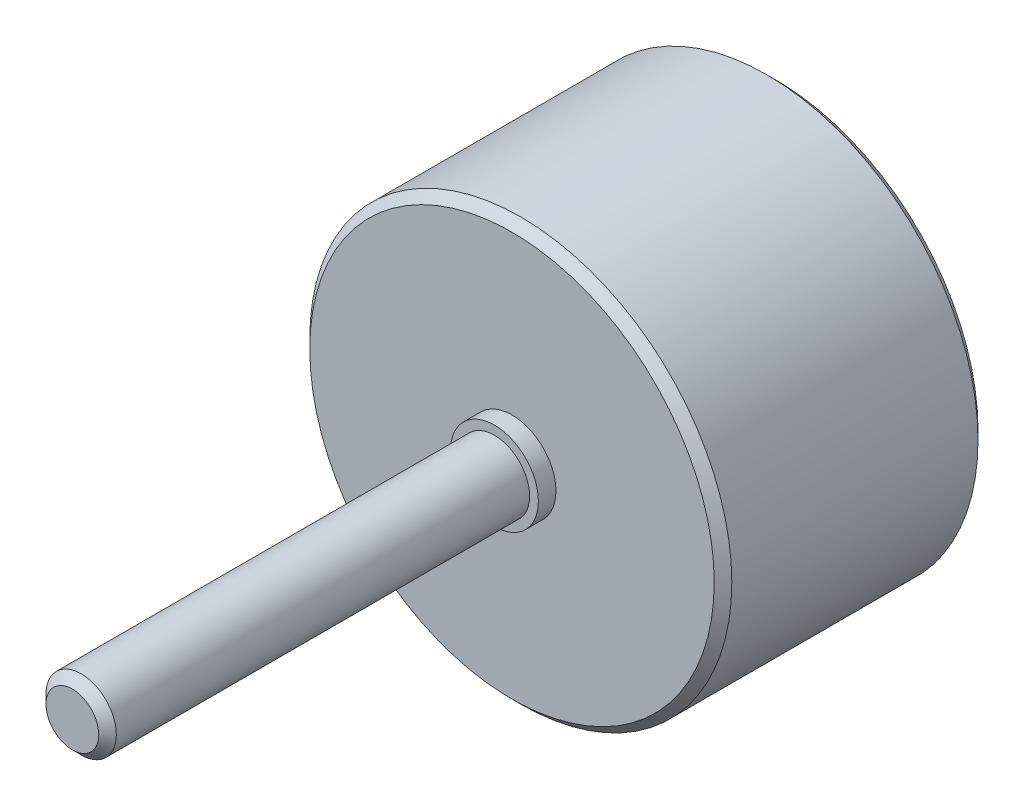
ISO-10303-21;
HEADER;
FILE_DESCRIPTION(('STEP AP214'),'2;1');
FILE_NAME('part.step','',(''),(''),'','','');
FILE_SCHEMA(('AUTOMOTIVE_DESIGN { 1 0 10303 214 1 1 1 1 }'));
ENDSEC;
DATA;
#1=APPLICATION_CONTEXT('core data for automotive mechanical design processes');
#2=APPLICATION_PROTOCOL_DEFINITION('international standard','automotive_design',2000,#1);
#3=PRODUCT_CONTEXT('',#1,'mechanical');
#4=PRODUCT('Part','Part','',(#3));
#5=PRODUCT_RELATED_PRODUCT_CATEGORY('part','',(#4));
#6=PRODUCT_DEFINITION_FORMATION('','',#4);
#7=PRODUCT_DEFINITION_CONTEXT('part definition',#1,'design');
#8=PRODUCT_DEFINITION('design','',#6,#7);
#9=PRODUCT_DEFINITION_SHAPE('','',#8);
#10=(LENGTH_UNIT() NAMED_UNIT(*) SI_UNIT(.MILLI.,.METRE.));
#11=(NAMED_UNIT(*) PLANE_ANGLE_UNIT() SI_UNIT($,.RADIAN.));
#12=(NAMED_UNIT(*) SI_UNIT($,.STERADIAN.) SOLID_ANGLE_UNIT());
#13=UNCERTAINTY_MEASURE_WITH_UNIT(LENGTH_MEASURE(1.E-05),#10,'distance_accuracy_value','');
#14=(GEOMETRIC_REPRESENTATION_CONTEXT(3) GLOBAL_UNCERTAINTY_ASSIGNED_CONTEXT((#13)) GLOBAL_UNIT_ASSIGNED_CONTEXT((#10,
#11,#12)) REPRESENTATION_CONTEXT('',''));
#15=CARTESIAN_POINT('',(0.,0.,0.));
#16=DIRECTION('',(0.,0.,1.));
#17=DIRECTION('',(1.,0.,0.));
#18=AXIS2_PLACEMENT_3D('',#15,#16,#17);
#19=CARTESIAN_POINT('',(0.,0.,30.));
#20=DIRECTION('',(0.,0.,-1.));
#21=DIRECTION('',(-1.,0.,0.));
#22=AXIS2_PLACEMENT_3D('',#19,#20,#21);
#23=CYLINDRICAL_SURFACE('',#22,24.);
#24=CARTESIAN_POINT('',(0.,0.,0.999999999999987));
#25=DIRECTION('',(0.,0.,1.));
#26=DIRECTION('',(1.,0.,0.));
#27=AXIS2_PLACEMENT_3D('',#24,#25,#26);
#28=CIRCLE('',#27,24.);
#29=CARTESIAN_POINT('',(24.,0.,0.999999999999987));
#30=VERTEX_POINT('',#29);
#31=EDGE_CURVE('E53',#30,#30,#28,.T.);
#32=ORIENTED_EDGE('',*,*,#31,.T.);
#33=EDGE_LOOP('',(#32));
#34=FACE_BOUND('',#33,.T.);
#35=CARTESIAN_POINT('',(0.,0.,29.));
#36=DIRECTION('',(0.,0.,1.));
#37=DIRECTION('',(1.,0.,0.));
#38=AXIS2_PLACEMENT_3D('',#35,#36,#37);
#39=CIRCLE('',#38,24.);
#40=CARTESIAN_POINT('',(24.,0.,29.));
#41=VERTEX_POINT('',#40);
#42=EDGE_CURVE('E56',#41,#41,#39,.F.);
#43=ORIENTED_EDGE('',*,*,#42,.T.);
#44=EDGE_LOOP('',(#43));
#45=FACE_BOUND('',#44,.T.);
#46=ADVANCED_FACE('F33',(#34,#45),#23,.T.);
#47=CARTESIAN_POINT('',(0.,0.,30.));
#48=DIRECTION('',(0.,0.,1.));
#49=DIRECTION('',(1.,0.,0.));
#50=AXIS2_PLACEMENT_3D('',#47,#48,#49);
#51=PLANE('',#50);
#52=CARTESIAN_POINT('',(0.,0.,30.));
#53=DIRECTION('',(0.,0.,1.));
#54=DIRECTION('',(1.,0.,0.));
#55=AXIS2_PLACEMENT_3D('',#52,#53,#54);
#56=CIRCLE('',#55,23.);
#57=CARTESIAN_POINT('',(23.,0.,30.));
#58=VERTEX_POINT('',#57);
#59=EDGE_CURVE('E44',#58,#58,#56,.T.);
#60=ORIENTED_EDGE('',*,*,#59,.T.);
#61=EDGE_LOOP('',(#60));
#62=FACE_BOUND('',#61,.T.);
#63=CARTESIAN_POINT('',(0.,0.,30.));
#64=DIRECTION('',(0.,0.,1.));
#65=DIRECTION('',(1.,0.,0.));
#66=AXIS2_PLACEMENT_3D('',#63,#64,#65);
#67=CIRCLE('',#66,5.);
#68=CARTESIAN_POINT('',(5.,0.,30.));
#69=VERTEX_POINT('',#68);
#70=EDGE_CURVE('E63',#69,#69,#67,.T.);
#71=ORIENTED_EDGE('',*,*,#70,.F.);
#72=EDGE_LOOP('',(#71));
#73=FACE_BOUND('',#72,.T.);
#74=ADVANCED_FACE('F87',(#62,#73),#51,.T.);
#75=CARTESIAN_POINT('',(0.,0.,0.));
#76=DIRECTION('',(0.,0.,1.));
#77=DIRECTION('',(1.,0.,0.));
#78=AXIS2_PLACEMENT_3D('',#75,#76,#77);
#79=PLANE('',#78);
#80=CARTESIAN_POINT('',(0.,0.,0.));
#81=DIRECTION('',(0.,0.,1.));
#82=DIRECTION('',(1.,0.,0.));
#83=AXIS2_PLACEMENT_3D('',#80,#81,#82);
#84=CIRCLE('',#83,23.);
#85=CARTESIAN_POINT('',(23.,0.,0.));
#86=VERTEX_POINT('',#85);
#87=EDGE_CURVE('E48',#86,#86,#84,.F.);
#88=ORIENTED_EDGE('',*,*,#87,.T.);
#89=EDGE_LOOP('',(#88));
#90=FACE_BOUND('',#89,.T.);
#91=CARTESIAN_POINT('',(0.,0.,0.));
#92=DIRECTION('',(0.,0.,-1.));
#93=DIRECTION('',(-1.,0.,0.));
#94=AXIS2_PLACEMENT_3D('',#91,#92,#93);
#95=CIRCLE('',#94,3.);
#96=CARTESIAN_POINT('',(-3.,0.,0.));
#97=VERTEX_POINT('',#96);
#98=EDGE_CURVE('E69',#97,#97,#95,.T.);
#99=ORIENTED_EDGE('',*,*,#98,.F.);
#100=EDGE_LOOP('',(#99));
#101=FACE_BOUND('',#100,.T.);
#102=ADVANCED_FACE('F84',(#90,#101),#79,.F.);
#103=CARTESIAN_POINT('',(0.,0.,32.));
#104=DIRECTION('',(0.,0.,-1.));
#105=DIRECTION('',(-1.,0.,0.));
#106=AXIS2_PLACEMENT_3D('',#103,#104,#105);
#107=CYLINDRICAL_SURFACE('',#106,5.);
#108=CARTESIAN_POINT('',(0.,0.,32.));
#109=DIRECTION('',(0.,0.,1.));
#110=DIRECTION('',(1.,0.,0.));
#111=AXIS2_PLACEMENT_3D('',#108,#109,#110);
#112=CIRCLE('',#111,5.);
#113=CARTESIAN_POINT('',(5.,0.,32.));
#114=VERTEX_POINT('',#113);
#115=EDGE_CURVE('E62',#114,#114,#112,.T.);
#116=ORIENTED_EDGE('',*,*,#115,.F.);
#117=EDGE_LOOP('',(#116));
#118=FACE_BOUND('',#117,.T.);
#119=ORIENTED_EDGE('',*,*,#70,.T.);
#120=EDGE_LOOP('',(#119));
#121=FACE_BOUND('',#120,.T.);
#122=ADVANCED_FACE('F86',(#118,#121),#107,.T.);
#123=CARTESIAN_POINT('',(0.,0.,32.));
#124=DIRECTION('',(0.,0.,1.));
#125=DIRECTION('',(1.,0.,0.));
#126=AXIS2_PLACEMENT_3D('',#123,#124,#125);
#127=PLANE('',#126);
#128=CARTESIAN_POINT('',(0.,0.,32.));
#129=DIRECTION('',(0.,0.,1.));
#130=DIRECTION('',(1.,0.,0.));
#131=AXIS2_PLACEMENT_3D('',#128,#129,#130);
#132=CIRCLE('',#131,4.);
#133=CARTESIAN_POINT('',(4.,0.,32.));
#134=VERTEX_POINT('',#133);
#135=EDGE_CURVE('E59',#134,#134,#132,.T.);
#136=ORIENTED_EDGE('',*,*,#135,.F.);
#137=EDGE_LOOP('',(#136));
#138=FACE_BOUND('',#137,.T.);
#139=ORIENTED_EDGE('',*,*,#115,.T.);
#140=EDGE_LOOP('',(#139));
#141=FACE_BOUND('',#140,.T.);
#142=ADVANCED_FACE('F94',(#138,#141),#127,.T.);
#143=CARTESIAN_POINT('',(0.,0.,80.));
#144=DIRECTION('',(0.,0.,1.));
#145=DIRECTION('',(1.,0.,0.));
#146=AXIS2_PLACEMENT_3D('',#143,#144,#145);
#147=PLANE('',#146);
#148=CARTESIAN_POINT('',(0.,0.,80.));
#149=DIRECTION('',(0.,0.,1.));
#150=DIRECTION('',(1.,0.,0.));
#151=AXIS2_PLACEMENT_3D('',#148,#149,#150);
#152=CIRCLE('',#151,3.00000000000002);
#153=CARTESIAN_POINT('',(3.00000000000002,0.,80.));
#154=VERTEX_POINT('',#153);
#155=EDGE_CURVE('E40',#154,#154,#152,.T.);
#156=ORIENTED_EDGE('',*,*,#155,.T.);
#157=EDGE_LOOP('',(#156));
#158=FACE_BOUND('',#157,.T.);
#159=ADVANCED_FACE('F146',(#158),#147,.T.);
#160=CARTESIAN_POINT('',(0.,0.,80.));
#161=DIRECTION('',(0.,0.,-1.));
#162=DIRECTION('',(-1.,0.,0.));
#163=AXIS2_PLACEMENT_3D('',#160,#161,#162);
#164=CYLINDRICAL_SURFACE('',#163,4.);
#165=CARTESIAN_POINT('',(0.,0.,79.));
#166=DIRECTION('',(0.,0.,1.));
#167=DIRECTION('',(1.,0.,0.));
#168=AXIS2_PLACEMENT_3D('',#165,#166,#167);
#169=CIRCLE('',#168,4.);
#170=CARTESIAN_POINT('',(4.,0.,79.));
#171=VERTEX_POINT('',#170);
#172=EDGE_CURVE('E10',#171,#171,#169,.F.);
#173=ORIENTED_EDGE('',*,*,#172,.T.);
#174=EDGE_LOOP('',(#173));
#175=FACE_BOUND('',#174,.T.);
#176=ORIENTED_EDGE('',*,*,#135,.T.);
#177=EDGE_LOOP('',(#176));
#178=FACE_BOUND('',#177,.T.);
#179=ADVANCED_FACE('F80',(#175,#178),#164,.T.);
#180=CARTESIAN_POINT('',(0.,0.,10.));
#181=DIRECTION('',(0.,0.,-1.));
#182=DIRECTION('',(-1.,0.,0.));
#183=AXIS2_PLACEMENT_3D('',#180,#181,#182);
#184=CYLINDRICAL_SURFACE('',#183,3.);
#185=CARTESIAN_POINT('',(0.,0.,10.));
#186=DIRECTION('',(0.,0.,-1.));
#187=DIRECTION('',(-1.,0.,0.));
#188=AXIS2_PLACEMENT_3D('',#185,#186,#187);
#189=CIRCLE('',#188,3.);
#190=CARTESIAN_POINT('',(-3.,0.,10.));
#191=VERTEX_POINT('',#190);
#192=EDGE_CURVE('E66',#191,#191,#189,.T.);
#193=ORIENTED_EDGE('',*,*,#192,.F.);
#194=EDGE_LOOP('',(#193));
#195=FACE_BOUND('',#194,.T.);
#196=ORIENTED_EDGE('',*,*,#98,.T.);
#197=EDGE_LOOP('',(#196));
#198=FACE_BOUND('',#197,.T.);
#199=ADVANCED_FACE('F77',(#195,#198),#184,.F.);
#200=CARTESIAN_POINT('',(0.,0.,10.));
#201=DIRECTION('',(0.,0.,-1.));
#202=DIRECTION('',(-1.,0.,0.));
#203=AXIS2_PLACEMENT_3D('',#200,#201,#202);
#204=PLANE('',#203);
#205=ORIENTED_EDGE('',*,*,#192,.T.);
#206=EDGE_LOOP('',(#205));
#207=FACE_BOUND('',#206,.T.);
#208=ADVANCED_FACE('F75',(#207),#204,.T.);
#209=CARTESIAN_POINT('',(0.,0.,0.999999999999987));
#210=DIRECTION('',(0.,0.,1.));
#211=DIRECTION('',(1.,0.,0.));
#212=AXIS2_PLACEMENT_3D('',#209,#210,#211);
#213=CONICAL_SURFACE('',#212,24.,0.785398163397452);
#214=ORIENTED_EDGE('',*,*,#87,.F.);
#215=EDGE_LOOP('',(#214));
#216=FACE_BOUND('',#215,.T.);
#217=ORIENTED_EDGE('',*,*,#31,.F.);
#218=EDGE_LOOP('',(#217));
#219=FACE_BOUND('',#218,.T.);
#220=ADVANCED_FACE('F106',(#216,#219),#213,.T.);
#221=CARTESIAN_POINT('',(0.,0.,30.));
#222=DIRECTION('',(0.,0.,-1.));
#223=DIRECTION('',(-1.,0.,0.));
#224=AXIS2_PLACEMENT_3D('',#221,#222,#223);
#225=CONICAL_SURFACE('',#224,23.,0.78539816339744);
#226=ORIENTED_EDGE('',*,*,#42,.F.);
#227=EDGE_LOOP('',(#226));
#228=FACE_BOUND('',#227,.T.);
#229=ORIENTED_EDGE('',*,*,#59,.F.);
#230=EDGE_LOOP('',(#229));
#231=FACE_BOUND('',#230,.T.);
#232=ADVANCED_FACE('F108',(#228,#231),#225,.T.);
#233=CARTESIAN_POINT('',(0.,0.,80.));
#234=DIRECTION('',(0.,0.,-1.));
#235=DIRECTION('',(-1.,0.,0.));
#236=AXIS2_PLACEMENT_3D('',#233,#234,#235);
#237=CONICAL_SURFACE('',#236,3.00000000000002,0.78539816339744);
#238=ORIENTED_EDGE('',*,*,#172,.F.);
#239=EDGE_LOOP('',(#238));
#240=FACE_BOUND('',#239,.T.);
#241=ORIENTED_EDGE('',*,*,#155,.F.);
#242=EDGE_LOOP('',(#241));
#243=FACE_BOUND('',#242,.T.);
#244=ADVANCED_FACE('F35',(#240,#243),#237,.T.);
#245=CLOSED_SHELL('',(#46,#74,#102,#122,#142,#159,#179,#199,#208,#220,#232,#244));
#246=MANIFOLD_SOLID_BREP('B2',#245);
#247=ADVANCED_BREP_SHAPE_REPRESENTATION('',(#18,#246),#14);
#248=SHAPE_DEFINITION_REPRESENTATION(#9,#247);
ENDSEC;
END-ISO-10303-21;
